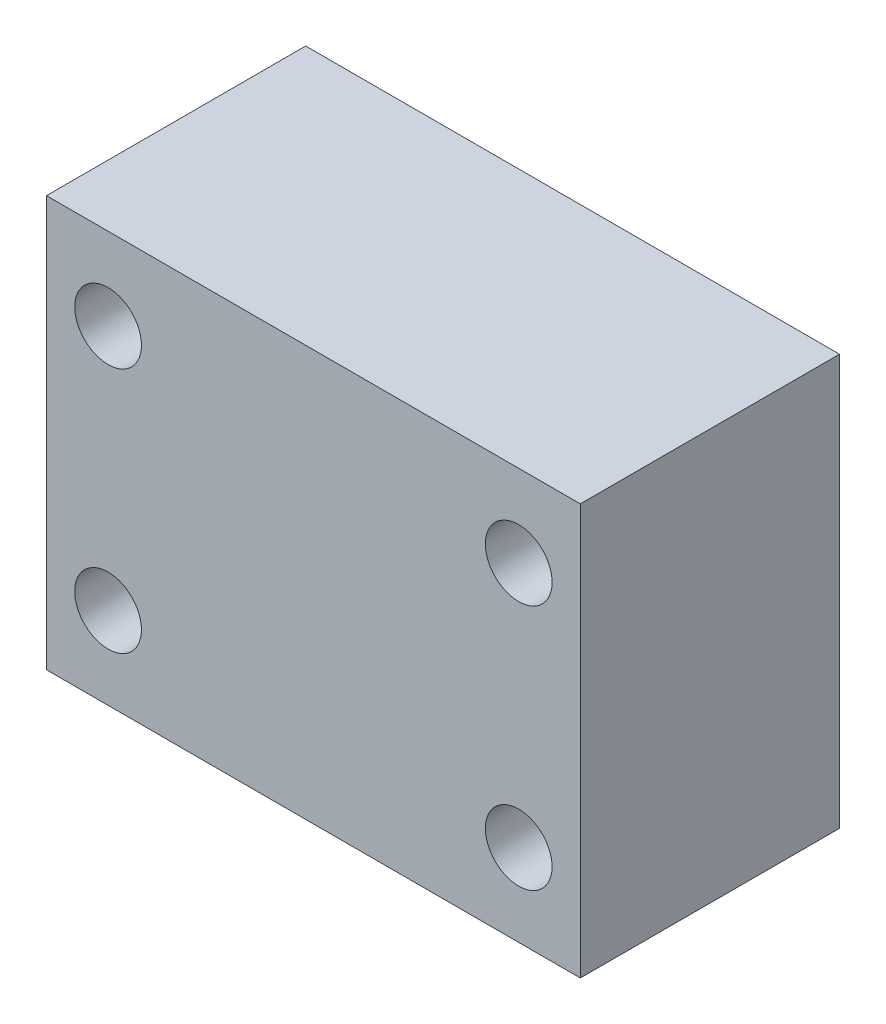
ISO-10303-21;
HEADER;
FILE_DESCRIPTION(('STEP AP214'),'2;1');
FILE_NAME('part.step','',(''),(''),'','','');
FILE_SCHEMA(('AUTOMOTIVE_DESIGN { 1 0 10303 214 1 1 1 1 }'));
ENDSEC;
DATA;
#1=APPLICATION_CONTEXT('core data for automotive mechanical design processes');
#2=APPLICATION_PROTOCOL_DEFINITION('international standard','automotive_design',2000,#1);
#3=PRODUCT_CONTEXT('',#1,'mechanical');
#4=PRODUCT('Part','Part','',(#3));
#5=PRODUCT_RELATED_PRODUCT_CATEGORY('part','',(#4));
#6=PRODUCT_DEFINITION_FORMATION('','',#4);
#7=PRODUCT_DEFINITION_CONTEXT('part definition',#1,'design');
#8=PRODUCT_DEFINITION('design','',#6,#7);
#9=PRODUCT_DEFINITION_SHAPE('','',#8);
#10=(LENGTH_UNIT() NAMED_UNIT(*) SI_UNIT(.MILLI.,.METRE.));
#11=(NAMED_UNIT(*) PLANE_ANGLE_UNIT() SI_UNIT($,.RADIAN.));
#12=(NAMED_UNIT(*) SI_UNIT($,.STERADIAN.) SOLID_ANGLE_UNIT());
#13=UNCERTAINTY_MEASURE_WITH_UNIT(LENGTH_MEASURE(1.E-05),#10,'distance_accuracy_value','');
#14=(GEOMETRIC_REPRESENTATION_CONTEXT(3) GLOBAL_UNCERTAINTY_ASSIGNED_CONTEXT((#13)) GLOBAL_UNIT_ASSIGNED_CONTEXT((#10,
#11,#12)) REPRESENTATION_CONTEXT('',''));
#15=CARTESIAN_POINT('',(0.,0.,0.));
#16=DIRECTION('',(0.,0.,1.));
#17=DIRECTION('',(1.,0.,0.));
#18=AXIS2_PLACEMENT_3D('',#15,#16,#17);
#19=CARTESIAN_POINT('',(26.,-20.,12.625));
#20=DIRECTION('',(-1.,0.,0.));
#21=DIRECTION('',(0.,0.,1.));
#22=AXIS2_PLACEMENT_3D('',#19,#20,#21);
#23=PLANE('',#22);
#24=DIRECTION('',(0.,1.,0.));
#25=VECTOR('',#24,1.);
#26=CARTESIAN_POINT('',(26.,-20.,-12.625));
#27=LINE('',#26,#25);
#28=CARTESIAN_POINT('',(26.,-20.,-12.625));
#29=VERTEX_POINT('',#28);
#30=CARTESIAN_POINT('',(26.,20.,-12.625));
#31=VERTEX_POINT('',#30);
#32=EDGE_CURVE('E107',#29,#31,#27,.T.);
#33=ORIENTED_EDGE('',*,*,#32,.T.);
#34=DIRECTION('',(0.,0.,-1.));
#35=VECTOR('',#34,1.);
#36=CARTESIAN_POINT('',(26.,20.,12.625));
#37=LINE('',#36,#35);
#38=CARTESIAN_POINT('',(26.,20.,12.625));
#39=VERTEX_POINT('',#38);
#40=EDGE_CURVE('E11',#39,#31,#37,.T.);
#41=ORIENTED_EDGE('',*,*,#40,.F.);
#42=DIRECTION('',(0.,1.,0.));
#43=VECTOR('',#42,1.);
#44=CARTESIAN_POINT('',(26.,-20.,12.625));
#45=LINE('',#44,#43);
#46=CARTESIAN_POINT('',(26.,-20.,12.625));
#47=VERTEX_POINT('',#46);
#48=EDGE_CURVE('E89',#47,#39,#45,.T.);
#49=ORIENTED_EDGE('',*,*,#48,.F.);
#50=DIRECTION('',(0.,0.,-1.));
#51=VECTOR('',#50,1.);
#52=CARTESIAN_POINT('',(26.,-20.,12.625));
#53=LINE('',#52,#51);
#54=EDGE_CURVE('E103',#47,#29,#53,.T.);
#55=ORIENTED_EDGE('',*,*,#54,.T.);
#56=EDGE_LOOP('',(#33,#41,#49,#55));
#57=FACE_BOUND('',#56,.T.);
#58=ADVANCED_FACE('F37',(#57),#23,.F.);
#59=CARTESIAN_POINT('',(-26.,20.,12.625));
#60=DIRECTION('',(0.,-1.,0.));
#61=DIRECTION('',(0.,0.,-1.));
#62=AXIS2_PLACEMENT_3D('',#59,#60,#61);
#63=PLANE('',#62);
#64=DIRECTION('',(-1.,0.,0.));
#65=VECTOR('',#64,1.);
#66=CARTESIAN_POINT('',(-26.,20.,-12.625));
#67=LINE('',#66,#65);
#68=CARTESIAN_POINT('',(-26.,20.,-12.625));
#69=VERTEX_POINT('',#68);
#70=EDGE_CURVE('E94',#31,#69,#67,.T.);
#71=ORIENTED_EDGE('',*,*,#70,.T.);
#72=DIRECTION('',(0.,0.,-1.));
#73=VECTOR('',#72,1.);
#74=CARTESIAN_POINT('',(-26.,20.,12.625));
#75=LINE('',#74,#73);
#76=CARTESIAN_POINT('',(-26.,20.,12.625));
#77=VERTEX_POINT('',#76);
#78=EDGE_CURVE('E46',#77,#69,#75,.T.);
#79=ORIENTED_EDGE('',*,*,#78,.F.);
#80=DIRECTION('',(-1.,0.,0.));
#81=VECTOR('',#80,1.);
#82=CARTESIAN_POINT('',(-26.,20.,12.625));
#83=LINE('',#82,#81);
#84=EDGE_CURVE('E84',#39,#77,#83,.T.);
#85=ORIENTED_EDGE('',*,*,#84,.F.);
#86=ORIENTED_EDGE('',*,*,#40,.T.);
#87=EDGE_LOOP('',(#71,#79,#85,#86));
#88=FACE_BOUND('',#87,.T.);
#89=ADVANCED_FACE('F93',(#88),#63,.F.);
#90=CARTESIAN_POINT('',(-26.,-20.,12.625));
#91=DIRECTION('',(1.,0.,0.));
#92=DIRECTION('',(0.,0.,-1.));
#93=AXIS2_PLACEMENT_3D('',#90,#91,#92);
#94=PLANE('',#93);
#95=DIRECTION('',(0.,-1.,0.));
#96=VECTOR('',#95,1.);
#97=CARTESIAN_POINT('',(-26.,-20.,-12.625));
#98=LINE('',#97,#96);
#99=CARTESIAN_POINT('',(-26.,-20.,-12.625));
#100=VERTEX_POINT('',#99);
#101=EDGE_CURVE('E71',#69,#100,#98,.T.);
#102=ORIENTED_EDGE('',*,*,#101,.T.);
#103=DIRECTION('',(0.,0.,-1.));
#104=VECTOR('',#103,1.);
#105=CARTESIAN_POINT('',(-26.,-20.,12.625));
#106=LINE('',#105,#104);
#107=CARTESIAN_POINT('',(-26.,-20.,12.625));
#108=VERTEX_POINT('',#107);
#109=EDGE_CURVE('E96',#108,#100,#106,.T.);
#110=ORIENTED_EDGE('',*,*,#109,.F.);
#111=DIRECTION('',(0.,-1.,0.));
#112=VECTOR('',#111,1.);
#113=CARTESIAN_POINT('',(-26.,-20.,12.625));
#114=LINE('',#113,#112);
#115=EDGE_CURVE('E87',#77,#108,#114,.T.);
#116=ORIENTED_EDGE('',*,*,#115,.F.);
#117=ORIENTED_EDGE('',*,*,#78,.T.);
#118=EDGE_LOOP('',(#102,#110,#116,#117));
#119=FACE_BOUND('',#118,.T.);
#120=ADVANCED_FACE('F97',(#119),#94,.F.);
#121=CARTESIAN_POINT('',(-26.,-20.,12.625));
#122=DIRECTION('',(0.,1.,0.));
#123=DIRECTION('',(0.,0.,1.));
#124=AXIS2_PLACEMENT_3D('',#121,#122,#123);
#125=PLANE('',#124);
#126=DIRECTION('',(1.,0.,0.));
#127=VECTOR('',#126,1.);
#128=CARTESIAN_POINT('',(-26.,-20.,-12.625));
#129=LINE('',#128,#127);
#130=EDGE_CURVE('E77',#100,#29,#129,.T.);
#131=ORIENTED_EDGE('',*,*,#130,.T.);
#132=ORIENTED_EDGE('',*,*,#54,.F.);
#133=DIRECTION('',(1.,0.,0.));
#134=VECTOR('',#133,1.);
#135=CARTESIAN_POINT('',(-26.,-20.,12.625));
#136=LINE('',#135,#134);
#137=EDGE_CURVE('E54',#108,#47,#136,.T.);
#138=ORIENTED_EDGE('',*,*,#137,.F.);
#139=ORIENTED_EDGE('',*,*,#109,.T.);
#140=EDGE_LOOP('',(#131,#132,#138,#139));
#141=FACE_BOUND('',#140,.T.);
#142=ADVANCED_FACE('F122',(#141),#125,.F.);
#143=CARTESIAN_POINT('',(0.,0.,12.625));
#144=DIRECTION('',(0.,0.,-1.));
#145=DIRECTION('',(-1.,0.,0.));
#146=AXIS2_PLACEMENT_3D('',#143,#144,#145);
#147=PLANE('',#146);
#148=CARTESIAN_POINT('',(20.,12.,12.625));
#149=DIRECTION('',(0.,0.,1.));
#150=DIRECTION('',(1.,0.,0.));
#151=AXIS2_PLACEMENT_3D('',#148,#149,#150);
#152=CIRCLE('',#151,3.25);
#153=CARTESIAN_POINT('',(23.25,12.,12.625));
#154=VERTEX_POINT('',#153);
#155=EDGE_CURVE('E145',#154,#154,#152,.T.);
#156=ORIENTED_EDGE('',*,*,#155,.F.);
#157=EDGE_LOOP('',(#156));
#158=FACE_BOUND('',#157,.T.);
#159=CARTESIAN_POINT('',(-20.,-12.,12.625));
#160=DIRECTION('',(0.,0.,1.));
#161=DIRECTION('',(1.,0.,0.));
#162=AXIS2_PLACEMENT_3D('',#159,#160,#161);
#163=CIRCLE('',#162,3.25);
#164=CARTESIAN_POINT('',(-16.75,-12.,12.625));
#165=VERTEX_POINT('',#164);
#166=EDGE_CURVE('E136',#165,#165,#163,.T.);
#167=ORIENTED_EDGE('',*,*,#166,.F.);
#168=EDGE_LOOP('',(#167));
#169=FACE_BOUND('',#168,.T.);
#170=CARTESIAN_POINT('',(20.,-12.,12.625));
#171=DIRECTION('',(0.,0.,1.));
#172=DIRECTION('',(1.,0.,0.));
#173=AXIS2_PLACEMENT_3D('',#170,#171,#172);
#174=CIRCLE('',#173,3.25);
#175=CARTESIAN_POINT('',(23.25,-12.,12.625));
#176=VERTEX_POINT('',#175);
#177=EDGE_CURVE('E151',#176,#176,#174,.T.);
#178=ORIENTED_EDGE('',*,*,#177,.F.);
#179=EDGE_LOOP('',(#178));
#180=FACE_BOUND('',#179,.T.);
#181=CARTESIAN_POINT('',(-20.,12.,12.625));
#182=DIRECTION('',(0.,0.,1.));
#183=DIRECTION('',(1.,0.,0.));
#184=AXIS2_PLACEMENT_3D('',#181,#182,#183);
#185=CIRCLE('',#184,3.25);
#186=CARTESIAN_POINT('',(-16.75,12.,12.625));
#187=VERTEX_POINT('',#186);
#188=EDGE_CURVE('E129',#187,#187,#185,.T.);
#189=ORIENTED_EDGE('',*,*,#188,.F.);
#190=EDGE_LOOP('',(#189));
#191=FACE_BOUND('',#190,.T.);
#192=ORIENTED_EDGE('',*,*,#48,.T.);
#193=ORIENTED_EDGE('',*,*,#84,.T.);
#194=ORIENTED_EDGE('',*,*,#115,.T.);
#195=ORIENTED_EDGE('',*,*,#137,.T.);
#196=EDGE_LOOP('',(#192,#193,#194,#195));
#197=FACE_BOUND('',#196,.T.);
#198=ADVANCED_FACE('F85',(#158,#169,#180,#191,#197),#147,.F.);
#199=CARTESIAN_POINT('',(0.,0.,-12.625));
#200=DIRECTION('',(0.,0.,-1.));
#201=DIRECTION('',(-1.,0.,0.));
#202=AXIS2_PLACEMENT_3D('',#199,#200,#201);
#203=PLANE('',#202);
#204=CARTESIAN_POINT('',(20.,12.,-12.625));
#205=DIRECTION('',(0.,0.,1.));
#206=DIRECTION('',(1.,0.,0.));
#207=AXIS2_PLACEMENT_3D('',#204,#205,#206);
#208=CIRCLE('',#207,3.25);
#209=CARTESIAN_POINT('',(23.25,12.,-12.625));
#210=VERTEX_POINT('',#209);
#211=EDGE_CURVE('E132',#210,#210,#208,.T.);
#212=ORIENTED_EDGE('',*,*,#211,.T.);
#213=EDGE_LOOP('',(#212));
#214=FACE_BOUND('',#213,.T.);
#215=CARTESIAN_POINT('',(-20.,-12.,-12.625));
#216=DIRECTION('',(0.,0.,1.));
#217=DIRECTION('',(1.,0.,0.));
#218=AXIS2_PLACEMENT_3D('',#215,#216,#217);
#219=CIRCLE('',#218,3.25);
#220=CARTESIAN_POINT('',(-16.75,-12.,-12.625));
#221=VERTEX_POINT('',#220);
#222=EDGE_CURVE('E140',#221,#221,#219,.T.);
#223=ORIENTED_EDGE('',*,*,#222,.T.);
#224=EDGE_LOOP('',(#223));
#225=FACE_BOUND('',#224,.T.);
#226=CARTESIAN_POINT('',(20.,-12.,-12.625));
#227=DIRECTION('',(0.,0.,1.));
#228=DIRECTION('',(1.,0.,0.));
#229=AXIS2_PLACEMENT_3D('',#226,#227,#228);
#230=CIRCLE('',#229,3.25);
#231=CARTESIAN_POINT('',(23.25,-12.,-12.625));
#232=VERTEX_POINT('',#231);
#233=EDGE_CURVE('E141',#232,#232,#230,.T.);
#234=ORIENTED_EDGE('',*,*,#233,.T.);
#235=EDGE_LOOP('',(#234));
#236=FACE_BOUND('',#235,.T.);
#237=CARTESIAN_POINT('',(-20.,12.,-12.625));
#238=DIRECTION('',(0.,0.,1.));
#239=DIRECTION('',(1.,0.,0.));
#240=AXIS2_PLACEMENT_3D('',#237,#238,#239);
#241=CIRCLE('',#240,3.25);
#242=CARTESIAN_POINT('',(-16.75,12.,-12.625));
#243=VERTEX_POINT('',#242);
#244=EDGE_CURVE('E111',#243,#243,#241,.T.);
#245=ORIENTED_EDGE('',*,*,#244,.T.);
#246=EDGE_LOOP('',(#245));
#247=FACE_BOUND('',#246,.T.);
#248=ORIENTED_EDGE('',*,*,#32,.F.);
#249=ORIENTED_EDGE('',*,*,#130,.F.);
#250=ORIENTED_EDGE('',*,*,#101,.F.);
#251=ORIENTED_EDGE('',*,*,#70,.F.);
#252=EDGE_LOOP('',(#248,#249,#250,#251));
#253=FACE_BOUND('',#252,.T.);
#254=ADVANCED_FACE('F125',(#214,#225,#236,#247,#253),#203,.T.);
#255=CARTESIAN_POINT('',(-20.,12.,-12.625));
#256=DIRECTION('',(0.,0.,1.));
#257=DIRECTION('',(1.,0.,0.));
#258=AXIS2_PLACEMENT_3D('',#255,#256,#257);
#259=CYLINDRICAL_SURFACE('',#258,3.25);
#260=ORIENTED_EDGE('',*,*,#244,.F.);
#261=EDGE_LOOP('',(#260));
#262=FACE_BOUND('',#261,.T.);
#263=ORIENTED_EDGE('',*,*,#188,.T.);
#264=EDGE_LOOP('',(#263));
#265=FACE_BOUND('',#264,.T.);
#266=ADVANCED_FACE('F164',(#262,#265),#259,.F.);
#267=CARTESIAN_POINT('',(20.,-12.,-12.625));
#268=DIRECTION('',(0.,0.,1.));
#269=DIRECTION('',(1.,0.,0.));
#270=AXIS2_PLACEMENT_3D('',#267,#268,#269);
#271=CYLINDRICAL_SURFACE('',#270,3.25);
#272=ORIENTED_EDGE('',*,*,#233,.F.);
#273=EDGE_LOOP('',(#272));
#274=FACE_BOUND('',#273,.T.);
#275=ORIENTED_EDGE('',*,*,#177,.T.);
#276=EDGE_LOOP('',(#275));
#277=FACE_BOUND('',#276,.T.);
#278=ADVANCED_FACE('F160',(#274,#277),#271,.F.);
#279=CARTESIAN_POINT('',(-20.,-12.,-12.625));
#280=DIRECTION('',(0.,0.,1.));
#281=DIRECTION('',(1.,0.,0.));
#282=AXIS2_PLACEMENT_3D('',#279,#280,#281);
#283=CYLINDRICAL_SURFACE('',#282,3.25);
#284=ORIENTED_EDGE('',*,*,#222,.F.);
#285=EDGE_LOOP('',(#284));
#286=FACE_BOUND('',#285,.T.);
#287=ORIENTED_EDGE('',*,*,#166,.T.);
#288=EDGE_LOOP('',(#287));
#289=FACE_BOUND('',#288,.T.);
#290=ADVANCED_FACE('F163',(#286,#289),#283,.F.);
#291=CARTESIAN_POINT('',(20.,12.,-12.625));
#292=DIRECTION('',(0.,0.,1.));
#293=DIRECTION('',(1.,0.,0.));
#294=AXIS2_PLACEMENT_3D('',#291,#292,#293);
#295=CYLINDRICAL_SURFACE('',#294,3.25);
#296=ORIENTED_EDGE('',*,*,#211,.F.);
#297=EDGE_LOOP('',(#296));
#298=FACE_BOUND('',#297,.T.);
#299=ORIENTED_EDGE('',*,*,#155,.T.);
#300=EDGE_LOOP('',(#299));
#301=FACE_BOUND('',#300,.T.);
#302=ADVANCED_FACE('F219',(#298,#301),#295,.F.);
#303=CLOSED_SHELL('',(#58,#89,#120,#142,#198,#254,#266,#278,#290,#302));
#304=MANIFOLD_SOLID_BREP('B2',#303);
#305=ADVANCED_BREP_SHAPE_REPRESENTATION('',(#18,#304),#14);
#306=SHAPE_DEFINITION_REPRESENTATION(#9,#305);
ENDSEC;
END-ISO-10303-21;
